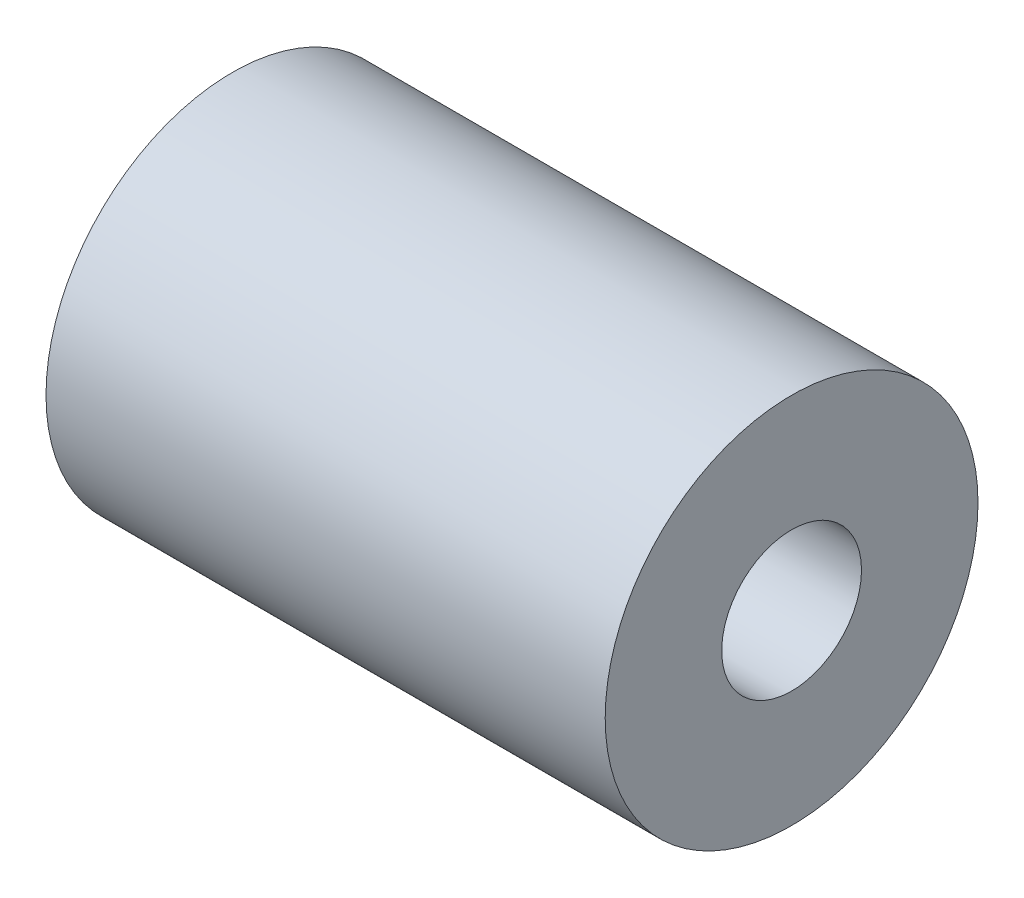
ISO-10303-21;
HEADER;
FILE_DESCRIPTION(('STEP AP214'),'2;1');
FILE_NAME('part.step','',(''),(''),'','','');
FILE_SCHEMA(('AUTOMOTIVE_DESIGN { 1 0 10303 214 1 1 1 1 }'));
ENDSEC;
DATA;
#1=APPLICATION_CONTEXT('core data for automotive mechanical design processes');
#2=APPLICATION_PROTOCOL_DEFINITION('international standard','automotive_design',2000,#1);
#3=PRODUCT_CONTEXT('',#1,'mechanical');
#4=PRODUCT('Part','Part','',(#3));
#5=PRODUCT_RELATED_PRODUCT_CATEGORY('part','',(#4));
#6=PRODUCT_DEFINITION_FORMATION('','',#4);
#7=PRODUCT_DEFINITION_CONTEXT('part definition',#1,'design');
#8=PRODUCT_DEFINITION('design','',#6,#7);
#9=PRODUCT_DEFINITION_SHAPE('','',#8);
#10=(LENGTH_UNIT() NAMED_UNIT(*) SI_UNIT(.MILLI.,.METRE.));
#11=(NAMED_UNIT(*) PLANE_ANGLE_UNIT() SI_UNIT($,.RADIAN.));
#12=(NAMED_UNIT(*) SI_UNIT($,.STERADIAN.) SOLID_ANGLE_UNIT());
#13=UNCERTAINTY_MEASURE_WITH_UNIT(LENGTH_MEASURE(1.E-05),#10,'distance_accuracy_value','');
#14=(GEOMETRIC_REPRESENTATION_CONTEXT(3) GLOBAL_UNCERTAINTY_ASSIGNED_CONTEXT((#13)) GLOBAL_UNIT_ASSIGNED_CONTEXT((#10,
#11,#12)) REPRESENTATION_CONTEXT('',''));
#15=CARTESIAN_POINT('',(0.,0.,0.));
#16=DIRECTION('',(0.,0.,1.));
#17=DIRECTION('',(1.,0.,0.));
#18=AXIS2_PLACEMENT_3D('',#15,#16,#17);
#19=CARTESIAN_POINT('',(12.,0.,0.));
#20=DIRECTION('',(1.,0.,0.));
#21=DIRECTION('',(0.,0.,-1.));
#22=AXIS2_PLACEMENT_3D('',#19,#20,#21);
#23=PLANE('',#22);
#24=CARTESIAN_POINT('',(12.,0.,0.));
#25=DIRECTION('',(1.,0.,0.));
#26=DIRECTION('',(0.,0.,-1.));
#27=AXIS2_PLACEMENT_3D('',#24,#25,#26);
#28=CIRCLE('',#27,4.);
#29=CARTESIAN_POINT('',(12.,0.,-4.));
#30=VERTEX_POINT('',#29);
#31=EDGE_CURVE('E10',#30,#30,#28,.T.);
#32=ORIENTED_EDGE('',*,*,#31,.T.);
#33=EDGE_LOOP('',(#32));
#34=FACE_BOUND('',#33,.T.);
#35=CARTESIAN_POINT('',(12.,0.,0.));
#36=DIRECTION('',(1.,0.,0.));
#37=DIRECTION('',(0.,0.,-1.));
#38=AXIS2_PLACEMENT_3D('',#35,#36,#37);
#39=CIRCLE('',#38,1.5);
#40=CARTESIAN_POINT('',(12.,0.,-1.5));
#41=VERTEX_POINT('',#40);
#42=EDGE_CURVE('E42',#41,#41,#39,.T.);
#43=ORIENTED_EDGE('',*,*,#42,.F.);
#44=EDGE_LOOP('',(#43));
#45=FACE_BOUND('',#44,.T.);
#46=ADVANCED_FACE('F31',(#34,#45),#23,.T.);
#47=CARTESIAN_POINT('',(0.,0.,0.));
#48=DIRECTION('',(1.,0.,0.));
#49=DIRECTION('',(0.,0.,-1.));
#50=AXIS2_PLACEMENT_3D('',#47,#48,#49);
#51=PLANE('',#50);
#52=CARTESIAN_POINT('',(0.,0.,0.));
#53=DIRECTION('',(1.,0.,0.));
#54=DIRECTION('',(0.,0.,-1.));
#55=AXIS2_PLACEMENT_3D('',#52,#53,#54);
#56=CIRCLE('',#55,4.);
#57=CARTESIAN_POINT('',(0.,0.,-4.));
#58=VERTEX_POINT('',#57);
#59=EDGE_CURVE('E35',#58,#58,#56,.T.);
#60=ORIENTED_EDGE('',*,*,#59,.F.);
#61=EDGE_LOOP('',(#60));
#62=FACE_BOUND('',#61,.T.);
#63=CARTESIAN_POINT('',(0.,0.,0.));
#64=DIRECTION('',(1.,0.,0.));
#65=DIRECTION('',(0.,0.,-1.));
#66=AXIS2_PLACEMENT_3D('',#63,#64,#65);
#67=CIRCLE('',#66,1.5);
#68=CARTESIAN_POINT('',(0.,0.,-1.5));
#69=VERTEX_POINT('',#68);
#70=EDGE_CURVE('E44',#69,#69,#67,.T.);
#71=ORIENTED_EDGE('',*,*,#70,.T.);
#72=EDGE_LOOP('',(#71));
#73=FACE_BOUND('',#72,.T.);
#74=ADVANCED_FACE('F54',(#62,#73),#51,.F.);
#75=CARTESIAN_POINT('',(12.,0.,0.));
#76=DIRECTION('',(-1.,0.,0.));
#77=DIRECTION('',(0.,0.,1.));
#78=AXIS2_PLACEMENT_3D('',#75,#76,#77);
#79=CYLINDRICAL_SURFACE('',#78,4.);
#80=ORIENTED_EDGE('',*,*,#31,.F.);
#81=EDGE_LOOP('',(#80));
#82=FACE_BOUND('',#81,.T.);
#83=ORIENTED_EDGE('',*,*,#59,.T.);
#84=EDGE_LOOP('',(#83));
#85=FACE_BOUND('',#84,.T.);
#86=ADVANCED_FACE('F33',(#82,#85),#79,.T.);
#87=CARTESIAN_POINT('',(12.,0.,0.));
#88=DIRECTION('',(-1.,0.,0.));
#89=DIRECTION('',(0.,0.,1.));
#90=AXIS2_PLACEMENT_3D('',#87,#88,#89);
#91=CYLINDRICAL_SURFACE('',#90,1.5);
#92=ORIENTED_EDGE('',*,*,#42,.T.);
#93=EDGE_LOOP('',(#92));
#94=FACE_BOUND('',#93,.T.);
#95=ORIENTED_EDGE('',*,*,#70,.F.);
#96=EDGE_LOOP('',(#95));
#97=FACE_BOUND('',#96,.T.);
#98=ADVANCED_FACE('F50',(#94,#97),#91,.F.);
#99=CLOSED_SHELL('',(#46,#74,#86,#98));
#100=MANIFOLD_SOLID_BREP('B2',#99);
#101=ADVANCED_BREP_SHAPE_REPRESENTATION('',(#18,#100),#14);
#102=SHAPE_DEFINITION_REPRESENTATION(#9,#101);
ENDSEC;
END-ISO-10303-21;
